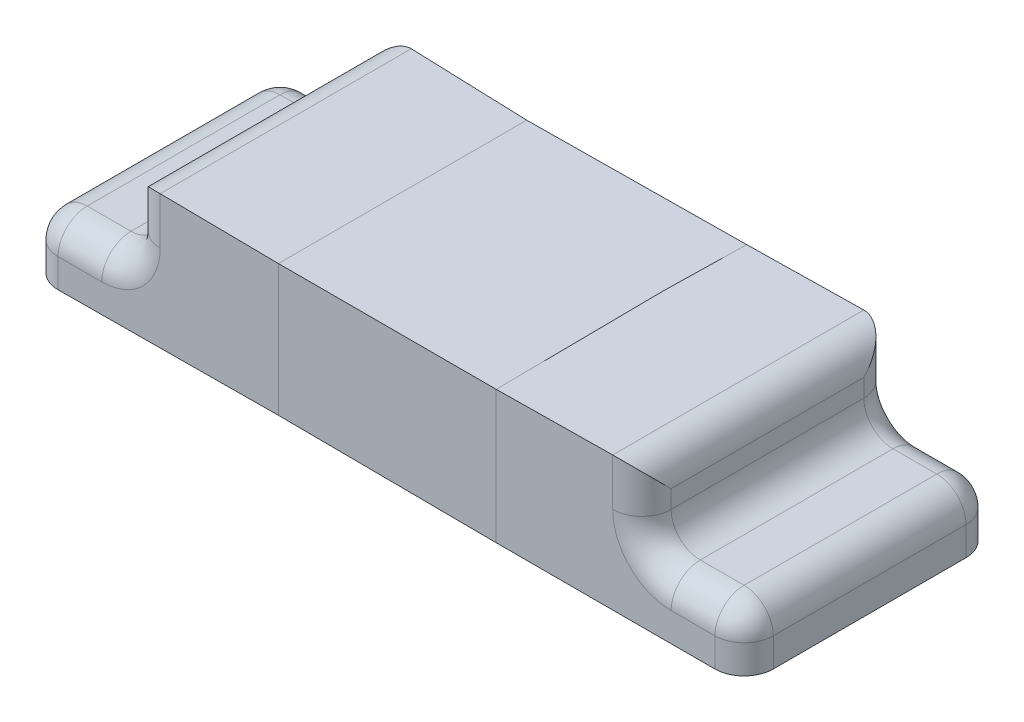
ISO-10303-21;
HEADER;
FILE_DESCRIPTION(('STEP AP214'),'2;1');
FILE_NAME('part.step','',(''),(''),'','','');
FILE_SCHEMA(('AUTOMOTIVE_DESIGN { 1 0 10303 214 1 1 1 1 }'));
ENDSEC;
DATA;
#1=APPLICATION_CONTEXT('core data for automotive mechanical design processes');
#2=APPLICATION_PROTOCOL_DEFINITION('international standard','automotive_design',2000,#1);
#3=PRODUCT_CONTEXT('',#1,'mechanical');
#4=PRODUCT('Part','Part','',(#3));
#5=PRODUCT_RELATED_PRODUCT_CATEGORY('part','',(#4));
#6=PRODUCT_DEFINITION_FORMATION('','',#4);
#7=PRODUCT_DEFINITION_CONTEXT('part definition',#1,'design');
#8=PRODUCT_DEFINITION('design','',#6,#7);
#9=PRODUCT_DEFINITION_SHAPE('','',#8);
#10=(LENGTH_UNIT() NAMED_UNIT(*) SI_UNIT(.MILLI.,.METRE.));
#11=(NAMED_UNIT(*) PLANE_ANGLE_UNIT() SI_UNIT($,.RADIAN.));
#12=(NAMED_UNIT(*) SI_UNIT($,.STERADIAN.) SOLID_ANGLE_UNIT());
#13=UNCERTAINTY_MEASURE_WITH_UNIT(LENGTH_MEASURE(1.E-05),#10,'distance_accuracy_value','');
#14=(GEOMETRIC_REPRESENTATION_CONTEXT(3) GLOBAL_UNCERTAINTY_ASSIGNED_CONTEXT((#13)) GLOBAL_UNIT_ASSIGNED_CONTEXT((#10,
#11,#12)) REPRESENTATION_CONTEXT('',''));
#15=CARTESIAN_POINT('',(0.,0.,0.));
#16=DIRECTION('',(0.,0.,1.));
#17=DIRECTION('',(1.,0.,0.));
#18=AXIS2_PLACEMENT_3D('',#15,#16,#17);
#19=CARTESIAN_POINT('',(-1.125,0.,0.33));
#20=DIRECTION('',(0.,1.,0.));
#21=DIRECTION('',(0.,0.,1.));
#22=AXIS2_PLACEMENT_3D('',#19,#20,#21);
#23=CYLINDRICAL_SURFACE('',#22,0.1);
#24=CARTESIAN_POINT('',(-1.125,0.098442990090282,0.33));
#25=DIRECTION('',(0.,-1.,0.));
#26=DIRECTION('',(0.,0.,-1.));
#27=AXIS2_PLACEMENT_3D('',#24,#25,#26);
#28=CIRCLE('',#27,0.1);
#29=CARTESIAN_POINT('',(-1.125,0.098442990090282,0.43));
#30=VERTEX_POINT('',#29);
#31=CARTESIAN_POINT('',(-1.225,0.098442990090282,0.33));
#32=VERTEX_POINT('',#31);
#33=EDGE_CURVE('E11',#30,#32,#28,.T.);
#34=ORIENTED_EDGE('',*,*,#33,.T.);
#35=DIRECTION('',(0.,1.,0.));
#36=VECTOR('',#35,1.);
#37=CARTESIAN_POINT('',(-1.225,0.098442990090282,0.33));
#38=LINE('',#37,#36);
#39=CARTESIAN_POINT('',(-1.225,0.,0.33));
#40=VERTEX_POINT('',#39);
#41=EDGE_CURVE('E216',#40,#32,#38,.T.);
#42=ORIENTED_EDGE('',*,*,#41,.F.);
#43=CARTESIAN_POINT('',(-1.125,0.,0.33));
#44=DIRECTION('',(0.,-1.,0.));
#45=DIRECTION('',(0.,0.,1.));
#46=AXIS2_PLACEMENT_3D('',#43,#44,#45);
#47=CIRCLE('',#46,0.1);
#48=CARTESIAN_POINT('',(-1.125,0.,0.43));
#49=VERTEX_POINT('',#48);
#50=EDGE_CURVE('E282',#49,#40,#47,.T.);
#51=ORIENTED_EDGE('',*,*,#50,.F.);
#52=DIRECTION('',(0.,-1.,0.));
#53=VECTOR('',#52,1.);
#54=CARTESIAN_POINT('',(-1.125,0.098442990090282,0.43));
#55=LINE('',#54,#53);
#56=EDGE_CURVE('E281',#30,#49,#55,.T.);
#57=ORIENTED_EDGE('',*,*,#56,.F.);
#58=EDGE_LOOP('',(#34,#42,#51,#57));
#59=FACE_BOUND('',#58,.T.);
#60=ADVANCED_FACE('F17',(#59),#23,.T.);
#61=CARTESIAN_POINT('',(-1.125,0.098442990090282,0.33));
#62=DIRECTION('',(0.,0.,1.));
#63=DIRECTION('',(1.,0.,0.));
#64=AXIS2_PLACEMENT_3D('',#61,#62,#63);
#65=SPHERICAL_SURFACE('',#64,0.1);
#66=CARTESIAN_POINT('',(-1.125,0.098442990090282,0.33));
#67=DIRECTION('',(1.,0.,0.));
#68=DIRECTION('',(0.,0.,-1.));
#69=AXIS2_PLACEMENT_3D('',#66,#67,#68);
#70=CIRCLE('',#69,0.1);
#71=CARTESIAN_POINT('',(-1.125,0.198442990090282,0.33));
#72=VERTEX_POINT('',#71);
#73=EDGE_CURVE('E265',#72,#30,#70,.T.);
#74=ORIENTED_EDGE('',*,*,#73,.F.);
#75=CARTESIAN_POINT('',(-1.125,0.098442990090282,0.33));
#76=DIRECTION('',(0.,0.,-1.));
#77=DIRECTION('',(-1.,0.,0.));
#78=AXIS2_PLACEMENT_3D('',#75,#76,#77);
#79=CIRCLE('',#78,0.1);
#80=EDGE_CURVE('E267',#32,#72,#79,.T.);
#81=ORIENTED_EDGE('',*,*,#80,.F.);
#82=ORIENTED_EDGE('',*,*,#33,.F.);
#83=EDGE_LOOP('',(#74,#81,#82));
#84=FACE_BOUND('',#83,.T.);
#85=ADVANCED_FACE('F264',(#84),#65,.T.);
#86=CARTESIAN_POINT('',(-1.125,0.,-0.33));
#87=DIRECTION('',(0.,-1.,0.));
#88=DIRECTION('',(0.,0.,-1.));
#89=AXIS2_PLACEMENT_3D('',#86,#87,#88);
#90=CYLINDRICAL_SURFACE('',#89,0.1);
#91=CARTESIAN_POINT('',(-1.125,0.,-0.33));
#92=DIRECTION('',(0.,-1.,0.));
#93=DIRECTION('',(0.,0.,1.));
#94=AXIS2_PLACEMENT_3D('',#91,#92,#93);
#95=CIRCLE('',#94,0.1);
#96=CARTESIAN_POINT('',(-1.225,0.,-0.33));
#97=VERTEX_POINT('',#96);
#98=CARTESIAN_POINT('',(-1.125,0.,-0.43));
#99=VERTEX_POINT('',#98);
#100=EDGE_CURVE('E457',#97,#99,#95,.T.);
#101=ORIENTED_EDGE('',*,*,#100,.F.);
#102=DIRECTION('',(0.,-1.,0.));
#103=VECTOR('',#102,1.);
#104=CARTESIAN_POINT('',(-1.225,0.,-0.33));
#105=LINE('',#104,#103);
#106=CARTESIAN_POINT('',(-1.225,0.098442990090282,-0.33));
#107=VERTEX_POINT('',#106);
#108=EDGE_CURVE('E205',#107,#97,#105,.T.);
#109=ORIENTED_EDGE('',*,*,#108,.F.);
#110=CARTESIAN_POINT('',(-1.125,0.098442990090282,-0.33));
#111=DIRECTION('',(0.,-1.,0.));
#112=DIRECTION('',(0.,0.,-1.));
#113=AXIS2_PLACEMENT_3D('',#110,#111,#112);
#114=CIRCLE('',#113,0.1);
#115=CARTESIAN_POINT('',(-1.125,0.098442990090282,-0.43));
#116=VERTEX_POINT('',#115);
#117=EDGE_CURVE('E30',#107,#116,#114,.T.);
#118=ORIENTED_EDGE('',*,*,#117,.T.);
#119=DIRECTION('',(0.,1.,0.));
#120=VECTOR('',#119,1.);
#121=CARTESIAN_POINT('',(-1.125,0.,-0.43));
#122=LINE('',#121,#120);
#123=EDGE_CURVE('E320',#99,#116,#122,.T.);
#124=ORIENTED_EDGE('',*,*,#123,.F.);
#125=EDGE_LOOP('',(#101,#109,#118,#124));
#126=FACE_BOUND('',#125,.T.);
#127=ADVANCED_FACE('F561',(#126),#90,.T.);
#128=CARTESIAN_POINT('',(-1.125,0.098442990090282,-0.33));
#129=DIRECTION('',(0.,0.,1.));
#130=DIRECTION('',(1.,0.,0.));
#131=AXIS2_PLACEMENT_3D('',#128,#129,#130);
#132=SPHERICAL_SURFACE('',#131,0.1);
#133=CARTESIAN_POINT('',(-1.125,0.098442990090282,-0.33));
#134=DIRECTION('',(0.,0.,1.));
#135=DIRECTION('',(-1.,0.,0.));
#136=AXIS2_PLACEMENT_3D('',#133,#134,#135);
#137=CIRCLE('',#136,0.1);
#138=CARTESIAN_POINT('',(-1.125,0.198442990090282,-0.33));
#139=VERTEX_POINT('',#138);
#140=EDGE_CURVE('E331',#139,#107,#137,.T.);
#141=ORIENTED_EDGE('',*,*,#140,.F.);
#142=CARTESIAN_POINT('',(-1.125,0.098442990090282,-0.33));
#143=DIRECTION('',(1.,0.,0.));
#144=DIRECTION('',(0.,0.,-1.));
#145=AXIS2_PLACEMENT_3D('',#142,#143,#144);
#146=CIRCLE('',#145,0.1);
#147=EDGE_CURVE('E305',#116,#139,#146,.T.);
#148=ORIENTED_EDGE('',*,*,#147,.F.);
#149=ORIENTED_EDGE('',*,*,#117,.F.);
#150=EDGE_LOOP('',(#141,#148,#149));
#151=FACE_BOUND('',#150,.T.);
#152=ADVANCED_FACE('F716',(#151),#132,.T.);
#153=CARTESIAN_POINT('',(-0.775,0.,-0.33));
#154=DIRECTION('',(0.,-1.,0.));
#155=DIRECTION('',(0.,0.,-1.));
#156=AXIS2_PLACEMENT_3D('',#153,#154,#155);
#157=CYLINDRICAL_SURFACE('',#156,0.1);
#158=CARTESIAN_POINT('',(-0.775,0.298442990090282,-0.33));
#159=DIRECTION('',(0.,1.,0.));
#160=DIRECTION('',(0.,0.,-1.));
#161=AXIS2_PLACEMENT_3D('',#158,#159,#160);
#162=CIRCLE('',#161,0.1);
#163=CARTESIAN_POINT('',(-0.775,0.298442990090282,-0.43));
#164=VERTEX_POINT('',#163);
#165=CARTESIAN_POINT('',(-0.875,0.298442990090282,-0.33));
#166=VERTEX_POINT('',#165);
#167=EDGE_CURVE('E637',#164,#166,#162,.T.);
#168=ORIENTED_EDGE('',*,*,#167,.T.);
#169=DIRECTION('',(0.,-1.,0.));
#170=VECTOR('',#169,1.);
#171=CARTESIAN_POINT('',(-0.875,0.298442990090282,-0.33));
#172=LINE('',#171,#170);
#173=CARTESIAN_POINT('',(-0.875,0.36,-0.33));
#174=VERTEX_POINT('',#173);
#175=EDGE_CURVE('E325',#174,#166,#172,.T.);
#176=ORIENTED_EDGE('',*,*,#175,.F.);
#177=CARTESIAN_POINT('',(-0.775,0.36,-0.33));
#178=DIRECTION('',(0.,-0.707106781186548,-0.707106781186548));
#179=DIRECTION('',(0.,0.707106781186548,-0.707106781186548));
#180=AXIS2_PLACEMENT_3D('',#177,#178,#179);
#181=ELLIPSE('',#180,0.141421356237309,0.1);
#182=CARTESIAN_POINT('',(-0.775,0.46,-0.43));
#183=VERTEX_POINT('',#182);
#184=EDGE_CURVE('E661',#174,#183,#181,.T.);
#185=ORIENTED_EDGE('',*,*,#184,.T.);
#186=DIRECTION('',(0.,1.,0.));
#187=VECTOR('',#186,1.);
#188=CARTESIAN_POINT('',(-0.775,0.298442990090282,-0.43));
#189=LINE('',#188,#187);
#190=EDGE_CURVE('E300',#164,#183,#189,.T.);
#191=ORIENTED_EDGE('',*,*,#190,.F.);
#192=EDGE_LOOP('',(#168,#176,#185,#191));
#193=FACE_BOUND('',#192,.T.);
#194=ADVANCED_FACE('F1270',(#193),#157,.T.);
#195=CARTESIAN_POINT('',(-0.775,0.36,0.43));
#196=DIRECTION('',(0.,0.,-1.));
#197=DIRECTION('',(-1.,0.,0.));
#198=AXIS2_PLACEMENT_3D('',#195,#196,#197);
#199=CYLINDRICAL_SURFACE('',#198,0.1);
#200=CARTESIAN_POINT('',(-0.775,0.36,0.33));
#201=DIRECTION('',(0.,0.707106781186548,-0.707106781186548));
#202=DIRECTION('',(0.,-0.707106781186548,-0.707106781186548));
#203=AXIS2_PLACEMENT_3D('',#200,#201,#202);
#204=ELLIPSE('',#203,0.141421356237309,0.1);
#205=CARTESIAN_POINT('',(-0.875,0.36,0.33));
#206=VERTEX_POINT('',#205);
#207=CARTESIAN_POINT('',(-0.775,0.46,0.43));
#208=VERTEX_POINT('',#207);
#209=EDGE_CURVE('E255',#206,#208,#204,.T.);
#210=ORIENTED_EDGE('',*,*,#209,.T.);
#211=DIRECTION('',(0.,0.,1.));
#212=VECTOR('',#211,1.);
#213=CARTESIAN_POINT('',(-0.775,0.46,-0.43));
#214=LINE('',#213,#212);
#215=EDGE_CURVE('E654',#183,#208,#214,.T.);
#216=ORIENTED_EDGE('',*,*,#215,.F.);
#217=ORIENTED_EDGE('',*,*,#184,.F.);
#218=DIRECTION('',(0.,0.,-1.));
#219=VECTOR('',#218,1.);
#220=CARTESIAN_POINT('',(-0.875,0.36,-0.33));
#221=LINE('',#220,#219);
#222=EDGE_CURVE('E653',#206,#174,#221,.T.);
#223=ORIENTED_EDGE('',*,*,#222,.F.);
#224=EDGE_LOOP('',(#210,#216,#217,#223));
#225=FACE_BOUND('',#224,.T.);
#226=ADVANCED_FACE('F512',(#225),#199,.T.);
#227=CARTESIAN_POINT('',(-0.975,0.298442990090282,-0.33));
#228=DIRECTION('',(0.,0.,-1.));
#229=DIRECTION('',(-1.,0.,0.));
#230=AXIS2_PLACEMENT_3D('',#227,#228,#229);
#231=TOROIDAL_SURFACE('',#230,0.2,0.1);
#232=CARTESIAN_POINT('',(-0.975,0.098442990090282,-0.33));
#233=DIRECTION('',(1.,0.,0.));
#234=DIRECTION('',(0.,0.,-1.));
#235=AXIS2_PLACEMENT_3D('',#232,#233,#234);
#236=CIRCLE('',#235,0.1);
#237=CARTESIAN_POINT('',(-0.975,0.098442990090282,-0.43));
#238=VERTEX_POINT('',#237);
#239=CARTESIAN_POINT('',(-0.975,0.198442990090282,-0.33));
#240=VERTEX_POINT('',#239);
#241=EDGE_CURVE('E308',#238,#240,#236,.T.);
#242=ORIENTED_EDGE('',*,*,#241,.T.);
#243=CARTESIAN_POINT('',(-0.975,0.298442990090282,-0.33));
#244=DIRECTION('',(0.,0.,1.));
#245=DIRECTION('',(-1.,0.,0.));
#246=AXIS2_PLACEMENT_3D('',#243,#244,#245);
#247=CIRCLE('',#246,0.1);
#248=EDGE_CURVE('E309',#240,#166,#247,.T.);
#249=ORIENTED_EDGE('',*,*,#248,.T.);
#250=ORIENTED_EDGE('',*,*,#167,.F.);
#251=CARTESIAN_POINT('',(-0.975,0.298442990090282,-0.43));
#252=DIRECTION('',(0.,0.,-1.));
#253=DIRECTION('',(-1.,0.,0.));
#254=AXIS2_PLACEMENT_3D('',#251,#252,#253);
#255=CIRCLE('',#254,0.2);
#256=EDGE_CURVE('E319',#164,#238,#255,.T.);
#257=ORIENTED_EDGE('',*,*,#256,.T.);
#258=EDGE_LOOP('',(#242,#249,#250,#257));
#259=FACE_BOUND('',#258,.T.);
#260=ADVANCED_FACE('F494',(#259),#231,.T.);
#261=CARTESIAN_POINT('',(-0.775,0.,0.33));
#262=DIRECTION('',(0.,1.,0.));
#263=DIRECTION('',(0.,0.,1.));
#264=AXIS2_PLACEMENT_3D('',#261,#262,#263);
#265=CYLINDRICAL_SURFACE('',#264,0.1);
#266=CARTESIAN_POINT('',(-0.775,0.298442990090282,0.33));
#267=DIRECTION('',(0.,1.,0.));
#268=DIRECTION('',(0.,0.,-1.));
#269=AXIS2_PLACEMENT_3D('',#266,#267,#268);
#270=CIRCLE('',#269,0.1);
#271=CARTESIAN_POINT('',(-0.875,0.298442990090282,0.33));
#272=VERTEX_POINT('',#271);
#273=CARTESIAN_POINT('',(-0.775,0.298442990090282,0.43));
#274=VERTEX_POINT('',#273);
#275=EDGE_CURVE('E353',#272,#274,#270,.T.);
#276=ORIENTED_EDGE('',*,*,#275,.T.);
#277=DIRECTION('',(0.,-1.,0.));
#278=VECTOR('',#277,1.);
#279=CARTESIAN_POINT('',(-0.775,0.46,0.43));
#280=LINE('',#279,#278);
#281=EDGE_CURVE('E379',#208,#274,#280,.T.);
#282=ORIENTED_EDGE('',*,*,#281,.F.);
#283=ORIENTED_EDGE('',*,*,#209,.F.);
#284=DIRECTION('',(0.,1.,0.));
#285=VECTOR('',#284,1.);
#286=CARTESIAN_POINT('',(-0.875,0.36,0.33));
#287=LINE('',#286,#285);
#288=EDGE_CURVE('E649',#272,#206,#287,.T.);
#289=ORIENTED_EDGE('',*,*,#288,.F.);
#290=EDGE_LOOP('',(#276,#282,#283,#289));
#291=FACE_BOUND('',#290,.T.);
#292=ADVANCED_FACE('F490',(#291),#265,.T.);
#293=CARTESIAN_POINT('',(-0.875,0.098442990090282,-0.33));
#294=DIRECTION('',(1.,0.,0.));
#295=DIRECTION('',(0.,0.,-1.));
#296=AXIS2_PLACEMENT_3D('',#293,#294,#295);
#297=CYLINDRICAL_SURFACE('',#296,0.1);
#298=DIRECTION('',(1.,0.,0.));
#299=VECTOR('',#298,1.);
#300=CARTESIAN_POINT('',(-1.125,0.098442990090282,-0.43));
#301=LINE('',#300,#299);
#302=EDGE_CURVE('E315',#116,#238,#301,.T.);
#303=ORIENTED_EDGE('',*,*,#302,.F.);
#304=ORIENTED_EDGE('',*,*,#147,.T.);
#305=DIRECTION('',(-1.,0.,0.));
#306=VECTOR('',#305,1.);
#307=CARTESIAN_POINT('',(-1.125,0.198442990090282,-0.33));
#308=LINE('',#307,#306);
#309=EDGE_CURVE('E337',#240,#139,#308,.T.);
#310=ORIENTED_EDGE('',*,*,#309,.F.);
#311=ORIENTED_EDGE('',*,*,#241,.F.);
#312=EDGE_LOOP('',(#303,#304,#310,#311));
#313=FACE_BOUND('',#312,.T.);
#314=ADVANCED_FACE('F493',(#313),#297,.T.);
#315=CARTESIAN_POINT('',(-0.975,0.298442990090282,0.));
#316=DIRECTION('',(0.,0.,1.));
#317=DIRECTION('',(1.,0.,0.));
#318=AXIS2_PLACEMENT_3D('',#315,#316,#317);
#319=CYLINDRICAL_SURFACE('',#318,0.1);
#320=CARTESIAN_POINT('',(-0.975,0.298442990090282,0.33));
#321=DIRECTION('',(0.,0.,1.));
#322=DIRECTION('',(1.,0.,0.));
#323=AXIS2_PLACEMENT_3D('',#320,#321,#322);
#324=CIRCLE('',#323,0.1);
#325=CARTESIAN_POINT('',(-0.975,0.198442990090282,0.33));
#326=VERTEX_POINT('',#325);
#327=EDGE_CURVE('E356',#326,#272,#324,.T.);
#328=ORIENTED_EDGE('',*,*,#327,.T.);
#329=DIRECTION('',(0.,0.,1.));
#330=VECTOR('',#329,1.);
#331=CARTESIAN_POINT('',(-0.875,0.298442990090282,-0.33));
#332=LINE('',#331,#330);
#333=EDGE_CURVE('E321',#166,#272,#332,.T.);
#334=ORIENTED_EDGE('',*,*,#333,.F.);
#335=ORIENTED_EDGE('',*,*,#248,.F.);
#336=DIRECTION('',(0.,0.,-1.));
#337=VECTOR('',#336,1.);
#338=CARTESIAN_POINT('',(-0.975,0.198442990090282,-0.33));
#339=LINE('',#338,#337);
#340=EDGE_CURVE('E664',#326,#240,#339,.T.);
#341=ORIENTED_EDGE('',*,*,#340,.F.);
#342=EDGE_LOOP('',(#328,#334,#335,#341));
#343=FACE_BOUND('',#342,.T.);
#344=ADVANCED_FACE('F1118',(#343),#319,.F.);
#345=CARTESIAN_POINT('',(-0.975,0.298442990090282,0.33));
#346=DIRECTION('',(0.,0.,1.));
#347=DIRECTION('',(1.,0.,0.));
#348=AXIS2_PLACEMENT_3D('',#345,#346,#347);
#349=TOROIDAL_SURFACE('',#348,0.2,0.1);
#350=ORIENTED_EDGE('',*,*,#275,.F.);
#351=ORIENTED_EDGE('',*,*,#327,.F.);
#352=CARTESIAN_POINT('',(-0.975,0.098442990090282,0.33));
#353=DIRECTION('',(1.,0.,0.));
#354=DIRECTION('',(0.,0.,-1.));
#355=AXIS2_PLACEMENT_3D('',#352,#353,#354);
#356=CIRCLE('',#355,0.1);
#357=CARTESIAN_POINT('',(-0.975,0.098442990090282,0.43));
#358=VERTEX_POINT('',#357);
#359=EDGE_CURVE('E279',#326,#358,#356,.T.);
#360=ORIENTED_EDGE('',*,*,#359,.T.);
#361=CARTESIAN_POINT('',(-0.975,0.298442990090282,0.43));
#362=DIRECTION('',(0.,0.,1.));
#363=DIRECTION('',(1.,0.,0.));
#364=AXIS2_PLACEMENT_3D('',#361,#362,#363);
#365=CIRCLE('',#364,0.2);
#366=EDGE_CURVE('E292',#358,#274,#365,.T.);
#367=ORIENTED_EDGE('',*,*,#366,.T.);
#368=EDGE_LOOP('',(#350,#351,#360,#367));
#369=FACE_BOUND('',#368,.T.);
#370=ADVANCED_FACE('F1113',(#369),#349,.T.);
#371=CARTESIAN_POINT('',(-1.125,0.098442990090282,0.43));
#372=DIRECTION('',(0.,0.,-1.));
#373=DIRECTION('',(-1.,0.,0.));
#374=AXIS2_PLACEMENT_3D('',#371,#372,#373);
#375=CYLINDRICAL_SURFACE('',#374,0.1);
#376=DIRECTION('',(0.,0.,1.));
#377=VECTOR('',#376,1.);
#378=CARTESIAN_POINT('',(-1.125,0.198442990090282,-0.33));
#379=LINE('',#378,#377);
#380=EDGE_CURVE('E334',#139,#72,#379,.T.);
#381=ORIENTED_EDGE('',*,*,#380,.F.);
#382=ORIENTED_EDGE('',*,*,#140,.T.);
#383=DIRECTION('',(0.,0.,-1.));
#384=VECTOR('',#383,1.);
#385=CARTESIAN_POINT('',(-1.225,0.098442990090282,-0.33));
#386=LINE('',#385,#384);
#387=EDGE_CURVE('E336',#32,#107,#386,.T.);
#388=ORIENTED_EDGE('',*,*,#387,.F.);
#389=ORIENTED_EDGE('',*,*,#80,.T.);
#390=EDGE_LOOP('',(#381,#382,#388,#389));
#391=FACE_BOUND('',#390,.T.);
#392=ADVANCED_FACE('F719',(#391),#375,.T.);
#393=CARTESIAN_POINT('',(-1.225,0.098442990090282,0.33));
#394=DIRECTION('',(1.,0.,0.));
#395=DIRECTION('',(0.,0.,-1.));
#396=AXIS2_PLACEMENT_3D('',#393,#394,#395);
#397=CYLINDRICAL_SURFACE('',#396,0.1);
#398=DIRECTION('',(1.,0.,0.));
#399=VECTOR('',#398,1.);
#400=CARTESIAN_POINT('',(-1.125,0.198442990090282,0.33));
#401=LINE('',#400,#399);
#402=EDGE_CURVE('E277',#72,#326,#401,.T.);
#403=ORIENTED_EDGE('',*,*,#402,.F.);
#404=ORIENTED_EDGE('',*,*,#73,.T.);
#405=DIRECTION('',(-1.,0.,0.));
#406=VECTOR('',#405,1.);
#407=CARTESIAN_POINT('',(-1.125,0.098442990090282,0.43));
#408=LINE('',#407,#406);
#409=EDGE_CURVE('E275',#358,#30,#408,.T.);
#410=ORIENTED_EDGE('',*,*,#409,.F.);
#411=ORIENTED_EDGE('',*,*,#359,.F.);
#412=EDGE_LOOP('',(#403,#404,#410,#411));
#413=FACE_BOUND('',#412,.T.);
#414=ADVANCED_FACE('F272',(#413),#397,.T.);
#415=CARTESIAN_POINT('',(-1.225,0.,0.));
#416=DIRECTION('',(1.,0.,0.));
#417=DIRECTION('',(0.,1.,0.));
#418=AXIS2_PLACEMENT_3D('',#415,#416,#417);
#419=PLANE('',#418);
#420=ORIENTED_EDGE('',*,*,#387,.T.);
#421=ORIENTED_EDGE('',*,*,#108,.T.);
#422=DIRECTION('',(0.,0.,-1.));
#423=VECTOR('',#422,1.);
#424=CARTESIAN_POINT('',(-1.225,0.,0.33));
#425=LINE('',#424,#423);
#426=EDGE_CURVE('E681',#40,#97,#425,.T.);
#427=ORIENTED_EDGE('',*,*,#426,.F.);
#428=ORIENTED_EDGE('',*,*,#41,.T.);
#429=EDGE_LOOP('',(#420,#421,#427,#428));
#430=FACE_BOUND('',#429,.T.);
#431=ADVANCED_FACE('F720',(#430),#419,.F.);
#432=CARTESIAN_POINT('',(-1.225,0.198442990090282,0.43));
#433=DIRECTION('',(0.,1.,0.));
#434=DIRECTION('',(1.,0.,0.));
#435=AXIS2_PLACEMENT_3D('',#432,#433,#434);
#436=PLANE('',#435);
#437=ORIENTED_EDGE('',*,*,#402,.T.);
#438=ORIENTED_EDGE('',*,*,#340,.T.);
#439=ORIENTED_EDGE('',*,*,#309,.T.);
#440=ORIENTED_EDGE('',*,*,#380,.T.);
#441=EDGE_LOOP('',(#437,#438,#439,#440));
#442=FACE_BOUND('',#441,.T.);
#443=ADVANCED_FACE('F19',(#442),#436,.T.);
#444=CARTESIAN_POINT('',(-0.875,0.,0.));
#445=DIRECTION('',(1.,0.,0.));
#446=DIRECTION('',(0.,1.,0.));
#447=AXIS2_PLACEMENT_3D('',#444,#445,#446);
#448=PLANE('',#447);
#449=ORIENTED_EDGE('',*,*,#288,.T.);
#450=ORIENTED_EDGE('',*,*,#222,.T.);
#451=ORIENTED_EDGE('',*,*,#175,.T.);
#452=ORIENTED_EDGE('',*,*,#333,.T.);
#453=EDGE_LOOP('',(#449,#450,#451,#452));
#454=FACE_BOUND('',#453,.T.);
#455=ADVANCED_FACE('F556',(#454),#448,.F.);
#456=CARTESIAN_POINT('',(-0.875,0.46,0.43));
#457=DIRECTION('',(0.,1.,0.));
#458=DIRECTION('',(1.,0.,0.));
#459=AXIS2_PLACEMENT_3D('',#456,#457,#458);
#460=PLANE('',#459);
#461=DIRECTION('',(1.,0.,0.));
#462=VECTOR('',#461,1.);
#463=CARTESIAN_POINT('',(-0.775,0.46,-0.43));
#464=LINE('',#463,#462);
#465=CARTESIAN_POINT('',(-0.375,0.450527864045,-0.4252639320225));
#466=VERTEX_POINT('',#465);
#467=EDGE_CURVE('E294',#183,#466,#464,.T.);
#468=ORIENTED_EDGE('',*,*,#467,.F.);
#469=ORIENTED_EDGE('',*,*,#215,.T.);
#470=DIRECTION('',(1.,0.,0.));
#471=VECTOR('',#470,1.);
#472=CARTESIAN_POINT('',(-0.775,0.46,0.43));
#473=LINE('',#472,#471);
#474=CARTESIAN_POINT('',(-0.375,0.450527864045,0.4252639320225));
#475=VERTEX_POINT('',#474);
#476=EDGE_CURVE('E286',#208,#475,#473,.T.);
#477=ORIENTED_EDGE('',*,*,#476,.T.);
#478=CARTESIAN_POINT('',(-0.375,0.45,-0.4252639320225));
#479=DIRECTION('',(0.,0.,1.));
#480=VECTOR('',#479,1.);
#481=LINE('',#478,#480);
#482=EDGE_CURVE('E387',#466,#475,#481,.T.);
#483=ORIENTED_EDGE('',*,*,#482,.F.);
#484=EDGE_LOOP('',(#468,#469,#477,#483));
#485=FACE_BOUND('',#484,.T.);
#486=ADVANCED_FACE('F511',(#485),#460,.T.);
#487=CARTESIAN_POINT('',(-0.875,0.,0.43));
#488=DIRECTION('',(0.,0.,1.));
#489=DIRECTION('',(1.,0.,0.));
#490=AXIS2_PLACEMENT_3D('',#487,#488,#489);
#491=PLANE('',#490);
#492=ORIENTED_EDGE('',*,*,#409,.T.);
#493=ORIENTED_EDGE('',*,*,#56,.T.);
#494=DIRECTION('',(1.,0.,0.));
#495=VECTOR('',#494,1.);
#496=CARTESIAN_POINT('',(-1.125,0.,0.43));
#497=LINE('',#496,#495);
#498=CARTESIAN_POINT('',(-0.375,0.,0.425));
#499=VERTEX_POINT('',#498);
#500=EDGE_CURVE('E424',#49,#499,#497,.T.);
#501=ORIENTED_EDGE('',*,*,#500,.T.);
#502=CARTESIAN_POINT('',(-0.375,0.450527864045,0.425));
#503=DIRECTION('',(0.,-1.,0.));
#504=VECTOR('',#503,1.);
#505=LINE('',#502,#504);
#506=EDGE_CURVE('E414',#475,#499,#505,.T.);
#507=ORIENTED_EDGE('',*,*,#506,.F.);
#508=ORIENTED_EDGE('',*,*,#476,.F.);
#509=ORIENTED_EDGE('',*,*,#281,.T.);
#510=ORIENTED_EDGE('',*,*,#366,.F.);
#511=EDGE_LOOP('',(#492,#493,#501,#507,#508,#509,#510));
#512=FACE_BOUND('',#511,.T.);
#513=ADVANCED_FACE('F289',(#512),#491,.T.);
#514=CARTESIAN_POINT('',(-0.875,0.,-0.43));
#515=DIRECTION('',(0.,0.,-1.));
#516=DIRECTION('',(0.,-1.,0.));
#517=AXIS2_PLACEMENT_3D('',#514,#515,#516);
#518=PLANE('',#517);
#519=DIRECTION('',(1.,0.,0.));
#520=VECTOR('',#519,1.);
#521=CARTESIAN_POINT('',(-1.125,0.,-0.43));
#522=LINE('',#521,#520);
#523=CARTESIAN_POINT('',(-0.375,0.,-0.425));
#524=VERTEX_POINT('',#523);
#525=EDGE_CURVE('E446',#99,#524,#522,.T.);
#526=ORIENTED_EDGE('',*,*,#525,.F.);
#527=ORIENTED_EDGE('',*,*,#123,.T.);
#528=ORIENTED_EDGE('',*,*,#302,.T.);
#529=ORIENTED_EDGE('',*,*,#256,.F.);
#530=ORIENTED_EDGE('',*,*,#190,.T.);
#531=ORIENTED_EDGE('',*,*,#467,.T.);
#532=CARTESIAN_POINT('',(-0.375,0.,-0.425));
#533=DIRECTION('',(0.,1.,0.));
#534=VECTOR('',#533,1.);
#535=LINE('',#532,#534);
#536=EDGE_CURVE('E397',#524,#466,#535,.T.);
#537=ORIENTED_EDGE('',*,*,#536,.F.);
#538=EDGE_LOOP('',(#526,#527,#528,#529,#530,#531,#537));
#539=FACE_BOUND('',#538,.T.);
#540=ADVANCED_FACE('F510',(#539),#518,.T.);
#541=CARTESIAN_POINT('',(1.125,0.,0.33));
#542=DIRECTION('',(0.,-1.,0.));
#543=DIRECTION('',(0.,0.,-1.));
#544=AXIS2_PLACEMENT_3D('',#541,#542,#543);
#545=CYLINDRICAL_SURFACE('',#544,0.1);
#546=CARTESIAN_POINT('',(1.125,0.098442990090282,0.33));
#547=DIRECTION('',(0.,-1.,0.));
#548=DIRECTION('',(0.,0.,-1.));
#549=AXIS2_PLACEMENT_3D('',#546,#547,#548);
#550=CIRCLE('',#549,0.1);
#551=CARTESIAN_POINT('',(1.225,0.098442990090282,0.33));
#552=VERTEX_POINT('',#551);
#553=CARTESIAN_POINT('',(1.125,0.098442990090282,0.43));
#554=VERTEX_POINT('',#553);
#555=EDGE_CURVE('E677',#552,#554,#550,.T.);
#556=ORIENTED_EDGE('',*,*,#555,.T.);
#557=DIRECTION('',(0.,1.,0.));
#558=VECTOR('',#557,1.);
#559=CARTESIAN_POINT('',(1.125,0.098442990090282,0.43));
#560=LINE('',#559,#558);
#561=CARTESIAN_POINT('',(1.125,0.,0.43));
#562=VERTEX_POINT('',#561);
#563=EDGE_CURVE('E402',#562,#554,#560,.T.);
#564=ORIENTED_EDGE('',*,*,#563,.F.);
#565=CARTESIAN_POINT('',(1.125,0.,0.33));
#566=DIRECTION('',(0.,-1.,0.));
#567=DIRECTION('',(0.,0.,1.));
#568=AXIS2_PLACEMENT_3D('',#565,#566,#567);
#569=CIRCLE('',#568,0.1);
#570=CARTESIAN_POINT('',(1.225,0.,0.33));
#571=VERTEX_POINT('',#570);
#572=EDGE_CURVE('E439',#571,#562,#569,.T.);
#573=ORIENTED_EDGE('',*,*,#572,.F.);
#574=DIRECTION('',(0.,-1.,0.));
#575=VECTOR('',#574,1.);
#576=CARTESIAN_POINT('',(1.225,0.098442990090282,0.33));
#577=LINE('',#576,#575);
#578=EDGE_CURVE('E632',#552,#571,#577,.T.);
#579=ORIENTED_EDGE('',*,*,#578,.F.);
#580=EDGE_LOOP('',(#556,#564,#573,#579));
#581=FACE_BOUND('',#580,.T.);
#582=ADVANCED_FACE('F565',(#581),#545,.T.);
#583=CARTESIAN_POINT('',(1.125,0.098442990090282,0.33));
#584=DIRECTION('',(0.,0.,1.));
#585=DIRECTION('',(1.,0.,0.));
#586=AXIS2_PLACEMENT_3D('',#583,#584,#585);
#587=SPHERICAL_SURFACE('',#586,0.1);
#588=CARTESIAN_POINT('',(1.125,0.098442990090282,0.33));
#589=DIRECTION('',(0.,0.,-1.));
#590=DIRECTION('',(1.,0.,0.));
#591=AXIS2_PLACEMENT_3D('',#588,#589,#590);
#592=CIRCLE('',#591,0.1);
#593=CARTESIAN_POINT('',(1.125,0.198442990090282,0.33));
#594=VERTEX_POINT('',#593);
#595=EDGE_CURVE('E347',#594,#552,#592,.T.);
#596=ORIENTED_EDGE('',*,*,#595,.F.);
#597=CARTESIAN_POINT('',(1.125,0.098442990090282,0.33));
#598=DIRECTION('',(-1.,0.,0.));
#599=DIRECTION('',(0.,0.,1.));
#600=AXIS2_PLACEMENT_3D('',#597,#598,#599);
#601=CIRCLE('',#600,0.1);
#602=EDGE_CURVE('E631',#554,#594,#601,.T.);
#603=ORIENTED_EDGE('',*,*,#602,.F.);
#604=ORIENTED_EDGE('',*,*,#555,.F.);
#605=EDGE_LOOP('',(#596,#603,#604));
#606=FACE_BOUND('',#605,.T.);
#607=ADVANCED_FACE('F562',(#606),#587,.T.);
#608=CARTESIAN_POINT('',(1.125,0.,-0.33));
#609=DIRECTION('',(0.,1.,0.));
#610=DIRECTION('',(0.,0.,1.));
#611=AXIS2_PLACEMENT_3D('',#608,#609,#610);
#612=CYLINDRICAL_SURFACE('',#611,0.1);
#613=CARTESIAN_POINT('',(1.125,0.,-0.33));
#614=DIRECTION('',(0.,-1.,0.));
#615=DIRECTION('',(0.,0.,1.));
#616=AXIS2_PLACEMENT_3D('',#613,#614,#615);
#617=CIRCLE('',#616,0.1);
#618=CARTESIAN_POINT('',(1.125,0.,-0.43));
#619=VERTEX_POINT('',#618);
#620=CARTESIAN_POINT('',(1.225,0.,-0.33));
#621=VERTEX_POINT('',#620);
#622=EDGE_CURVE('E445',#619,#621,#617,.T.);
#623=ORIENTED_EDGE('',*,*,#622,.F.);
#624=DIRECTION('',(0.,-1.,0.));
#625=VECTOR('',#624,1.);
#626=CARTESIAN_POINT('',(1.125,0.,-0.43));
#627=LINE('',#626,#625);
#628=CARTESIAN_POINT('',(1.125,0.098442990090282,-0.43));
#629=VERTEX_POINT('',#628);
#630=EDGE_CURVE('E314',#629,#619,#627,.T.);
#631=ORIENTED_EDGE('',*,*,#630,.F.);
#632=CARTESIAN_POINT('',(1.125,0.098442990090282,-0.33));
#633=DIRECTION('',(0.,-1.,0.));
#634=DIRECTION('',(0.,0.,-1.));
#635=AXIS2_PLACEMENT_3D('',#632,#633,#634);
#636=CIRCLE('',#635,0.1);
#637=CARTESIAN_POINT('',(1.225,0.098442990090282,-0.33));
#638=VERTEX_POINT('',#637);
#639=EDGE_CURVE('E674',#629,#638,#636,.T.);
#640=ORIENTED_EDGE('',*,*,#639,.T.);
#641=DIRECTION('',(0.,1.,0.));
#642=VECTOR('',#641,1.);
#643=CARTESIAN_POINT('',(1.225,0.,-0.33));
#644=LINE('',#643,#642);
#645=EDGE_CURVE('E622',#621,#638,#644,.T.);
#646=ORIENTED_EDGE('',*,*,#645,.F.);
#647=EDGE_LOOP('',(#623,#631,#640,#646));
#648=FACE_BOUND('',#647,.T.);
#649=ADVANCED_FACE('F564',(#648),#612,.T.);
#650=CARTESIAN_POINT('',(1.125,0.098442990090282,-0.33));
#651=DIRECTION('',(0.,0.,1.));
#652=DIRECTION('',(1.,0.,0.));
#653=AXIS2_PLACEMENT_3D('',#650,#651,#652);
#654=SPHERICAL_SURFACE('',#653,0.1);
#655=CARTESIAN_POINT('',(1.125,0.098442990090282,-0.33));
#656=DIRECTION('',(-1.,0.,0.));
#657=DIRECTION('',(0.,0.,1.));
#658=AXIS2_PLACEMENT_3D('',#655,#656,#657);
#659=CIRCLE('',#658,0.1);
#660=CARTESIAN_POINT('',(1.125,0.198442990090282,-0.33));
#661=VERTEX_POINT('',#660);
#662=EDGE_CURVE('E329',#661,#629,#659,.T.);
#663=ORIENTED_EDGE('',*,*,#662,.F.);
#664=CARTESIAN_POINT('',(1.125,0.098442990090282,-0.33));
#665=DIRECTION('',(0.,0.,1.));
#666=DIRECTION('',(1.,0.,0.));
#667=AXIS2_PLACEMENT_3D('',#664,#665,#666);
#668=CIRCLE('',#667,0.1);
#669=EDGE_CURVE('E363',#638,#661,#668,.T.);
#670=ORIENTED_EDGE('',*,*,#669,.F.);
#671=ORIENTED_EDGE('',*,*,#639,.F.);
#672=EDGE_LOOP('',(#663,#670,#671));
#673=FACE_BOUND('',#672,.T.);
#674=ADVANCED_FACE('F1322',(#673),#654,.T.);
#675=CARTESIAN_POINT('',(0.775,0.,-0.33));
#676=DIRECTION('',(0.,1.,0.));
#677=DIRECTION('',(0.,0.,1.));
#678=AXIS2_PLACEMENT_3D('',#675,#676,#677);
#679=CYLINDRICAL_SURFACE('',#678,0.1);
#680=CARTESIAN_POINT('',(0.775,0.298442990090282,-0.33));
#681=DIRECTION('',(0.,1.,0.));
#682=DIRECTION('',(0.,0.,-1.));
#683=AXIS2_PLACEMENT_3D('',#680,#681,#682);
#684=CIRCLE('',#683,0.1);
#685=CARTESIAN_POINT('',(0.875,0.298442990090282,-0.33));
#686=VERTEX_POINT('',#685);
#687=CARTESIAN_POINT('',(0.775,0.298442990090282,-0.43));
#688=VERTEX_POINT('',#687);
#689=EDGE_CURVE('E348',#686,#688,#684,.T.);
#690=ORIENTED_EDGE('',*,*,#689,.T.);
#691=DIRECTION('',(0.,-1.,0.));
#692=VECTOR('',#691,1.);
#693=CARTESIAN_POINT('',(0.775,0.298442990090282,-0.43));
#694=LINE('',#693,#692);
#695=CARTESIAN_POINT('',(0.775,0.46,-0.43));
#696=VERTEX_POINT('',#695);
#697=EDGE_CURVE('E421',#696,#688,#694,.T.);
#698=ORIENTED_EDGE('',*,*,#697,.F.);
#699=CARTESIAN_POINT('',(0.775,0.36,-0.33));
#700=DIRECTION('',(0.,-0.707106781186548,-0.707106781186548));
#701=DIRECTION('',(0.,-0.707106781186548,0.707106781186548));
#702=AXIS2_PLACEMENT_3D('',#699,#700,#701);
#703=ELLIPSE('',#702,0.141421356237309,0.1);
#704=CARTESIAN_POINT('',(0.875,0.36,-0.33));
#705=VERTEX_POINT('',#704);
#706=EDGE_CURVE('E351',#696,#705,#703,.T.);
#707=ORIENTED_EDGE('',*,*,#706,.T.);
#708=DIRECTION('',(0.,1.,0.));
#709=VECTOR('',#708,1.);
#710=CARTESIAN_POINT('',(0.875,0.298442990090282,-0.33));
#711=LINE('',#710,#709);
#712=EDGE_CURVE('E612',#686,#705,#711,.T.);
#713=ORIENTED_EDGE('',*,*,#712,.F.);
#714=EDGE_LOOP('',(#690,#698,#707,#713));
#715=FACE_BOUND('',#714,.T.);
#716=ADVANCED_FACE('F1306',(#715),#679,.T.);
#717=CARTESIAN_POINT('',(0.775,0.36,0.));
#718=DIRECTION('',(0.,0.,1.));
#719=DIRECTION('',(1.,0.,0.));
#720=AXIS2_PLACEMENT_3D('',#717,#718,#719);
#721=CYLINDRICAL_SURFACE('',#720,0.1);
#722=CARTESIAN_POINT('',(0.775,0.36,0.33));
#723=DIRECTION('',(0.,0.707106781186548,-0.707106781186548));
#724=DIRECTION('',(0.,0.707106781186548,0.707106781186548));
#725=AXIS2_PLACEMENT_3D('',#722,#723,#724);
#726=ELLIPSE('',#725,0.141421356237309,0.1);
#727=CARTESIAN_POINT('',(0.775,0.46,0.43));
#728=VERTEX_POINT('',#727);
#729=CARTESIAN_POINT('',(0.875,0.36,0.33));
#730=VERTEX_POINT('',#729);
#731=EDGE_CURVE('E352',#728,#730,#726,.T.);
#732=ORIENTED_EDGE('',*,*,#731,.T.);
#733=DIRECTION('',(0.,0.,1.));
#734=VECTOR('',#733,1.);
#735=CARTESIAN_POINT('',(0.875,0.36,-0.33));
#736=LINE('',#735,#734);
#737=EDGE_CURVE('E344',#705,#730,#736,.T.);
#738=ORIENTED_EDGE('',*,*,#737,.F.);
#739=ORIENTED_EDGE('',*,*,#706,.F.);
#740=DIRECTION('',(0.,0.,-1.));
#741=VECTOR('',#740,1.);
#742=CARTESIAN_POINT('',(0.775,0.46,-0.43));
#743=LINE('',#742,#741);
#744=EDGE_CURVE('E368',#728,#696,#743,.T.);
#745=ORIENTED_EDGE('',*,*,#744,.F.);
#746=EDGE_LOOP('',(#732,#738,#739,#745));
#747=FACE_BOUND('',#746,.T.);
#748=ADVANCED_FACE('F1301',(#747),#721,.T.);
#749=CARTESIAN_POINT('',(0.975,0.298442990090282,-0.33));
#750=DIRECTION('',(0.,0.,1.));
#751=DIRECTION('',(1.,0.,0.));
#752=AXIS2_PLACEMENT_3D('',#749,#750,#751);
#753=TOROIDAL_SURFACE('',#752,0.2,0.1);
#754=CARTESIAN_POINT('',(0.975,0.098442990090282,-0.33));
#755=DIRECTION('',(-1.,0.,0.));
#756=DIRECTION('',(0.,0.,1.));
#757=AXIS2_PLACEMENT_3D('',#754,#755,#756);
#758=CIRCLE('',#757,0.1);
#759=CARTESIAN_POINT('',(0.975,0.198442990090282,-0.33));
#760=VERTEX_POINT('',#759);
#761=CARTESIAN_POINT('',(0.975,0.098442990090282,-0.43));
#762=VERTEX_POINT('',#761);
#763=EDGE_CURVE('E685',#760,#762,#758,.T.);
#764=ORIENTED_EDGE('',*,*,#763,.T.);
#765=CARTESIAN_POINT('',(0.975,0.298442990090282,-0.43));
#766=DIRECTION('',(0.,0.,-1.));
#767=DIRECTION('',(1.,0.,0.));
#768=AXIS2_PLACEMENT_3D('',#765,#766,#767);
#769=CIRCLE('',#768,0.2);
#770=EDGE_CURVE('E408',#762,#688,#769,.T.);
#771=ORIENTED_EDGE('',*,*,#770,.T.);
#772=ORIENTED_EDGE('',*,*,#689,.F.);
#773=CARTESIAN_POINT('',(0.975,0.298442990090282,-0.33));
#774=DIRECTION('',(0.,0.,1.));
#775=DIRECTION('',(1.,0.,0.));
#776=AXIS2_PLACEMENT_3D('',#773,#774,#775);
#777=CIRCLE('',#776,0.1);
#778=EDGE_CURVE('E670',#686,#760,#777,.T.);
#779=ORIENTED_EDGE('',*,*,#778,.T.);
#780=EDGE_LOOP('',(#764,#771,#772,#779));
#781=FACE_BOUND('',#780,.T.);
#782=ADVANCED_FACE('F505',(#781),#753,.T.);
#783=CARTESIAN_POINT('',(0.775,0.,0.33));
#784=DIRECTION('',(0.,-1.,0.));
#785=DIRECTION('',(0.,0.,-1.));
#786=AXIS2_PLACEMENT_3D('',#783,#784,#785);
#787=CYLINDRICAL_SURFACE('',#786,0.1);
#788=CARTESIAN_POINT('',(0.775,0.298442990090282,0.33));
#789=DIRECTION('',(0.,1.,0.));
#790=DIRECTION('',(0.,0.,-1.));
#791=AXIS2_PLACEMENT_3D('',#788,#789,#790);
#792=CIRCLE('',#791,0.1);
#793=CARTESIAN_POINT('',(0.775,0.298442990090282,0.43));
#794=VERTEX_POINT('',#793);
#795=CARTESIAN_POINT('',(0.875,0.298442990090282,0.33));
#796=VERTEX_POINT('',#795);
#797=EDGE_CURVE('E326',#794,#796,#792,.T.);
#798=ORIENTED_EDGE('',*,*,#797,.T.);
#799=DIRECTION('',(0.,-1.,0.));
#800=VECTOR('',#799,1.);
#801=CARTESIAN_POINT('',(0.875,0.36,0.33));
#802=LINE('',#801,#800);
#803=EDGE_CURVE('E339',#730,#796,#802,.T.);
#804=ORIENTED_EDGE('',*,*,#803,.F.);
#805=ORIENTED_EDGE('',*,*,#731,.F.);
#806=DIRECTION('',(0.,1.,0.));
#807=VECTOR('',#806,1.);
#808=CARTESIAN_POINT('',(0.775,0.46,0.43));
#809=LINE('',#808,#807);
#810=EDGE_CURVE('E357',#794,#728,#809,.T.);
#811=ORIENTED_EDGE('',*,*,#810,.F.);
#812=EDGE_LOOP('',(#798,#804,#805,#811));
#813=FACE_BOUND('',#812,.T.);
#814=ADVANCED_FACE('F502',(#813),#787,.T.);
#815=CARTESIAN_POINT('',(0.975,0.298442990090282,0.43));
#816=DIRECTION('',(0.,0.,-1.));
#817=DIRECTION('',(-1.,0.,0.));
#818=AXIS2_PLACEMENT_3D('',#815,#816,#817);
#819=CYLINDRICAL_SURFACE('',#818,0.1);
#820=CARTESIAN_POINT('',(0.975,0.298442990090282,0.33));
#821=DIRECTION('',(0.,0.,1.));
#822=DIRECTION('',(-1.,0.,0.));
#823=AXIS2_PLACEMENT_3D('',#820,#821,#822);
#824=CIRCLE('',#823,0.1);
#825=CARTESIAN_POINT('',(0.975,0.198442990090282,0.33));
#826=VERTEX_POINT('',#825);
#827=EDGE_CURVE('E330',#796,#826,#824,.T.);
#828=ORIENTED_EDGE('',*,*,#827,.T.);
#829=DIRECTION('',(0.,0.,1.));
#830=VECTOR('',#829,1.);
#831=CARTESIAN_POINT('',(0.975,0.198442990090282,-0.33));
#832=LINE('',#831,#830);
#833=EDGE_CURVE('E642',#760,#826,#832,.T.);
#834=ORIENTED_EDGE('',*,*,#833,.F.);
#835=ORIENTED_EDGE('',*,*,#778,.F.);
#836=DIRECTION('',(0.,0.,-1.));
#837=VECTOR('',#836,1.);
#838=CARTESIAN_POINT('',(0.875,0.298442990090282,-0.33));
#839=LINE('',#838,#837);
#840=EDGE_CURVE('E343',#796,#686,#839,.T.);
#841=ORIENTED_EDGE('',*,*,#840,.F.);
#842=EDGE_LOOP('',(#828,#834,#835,#841));
#843=FACE_BOUND('',#842,.T.);
#844=ADVANCED_FACE('F500',(#843),#819,.F.);
#845=CARTESIAN_POINT('',(1.225,0.098442990090282,-0.33));
#846=DIRECTION('',(-1.,0.,0.));
#847=DIRECTION('',(0.,0.,1.));
#848=AXIS2_PLACEMENT_3D('',#845,#846,#847);
#849=CYLINDRICAL_SURFACE('',#848,0.1);
#850=DIRECTION('',(-1.,0.,0.));
#851=VECTOR('',#850,1.);
#852=CARTESIAN_POINT('',(1.125,0.198442990090282,-0.33));
#853=LINE('',#852,#851);
#854=EDGE_CURVE('E361',#661,#760,#853,.T.);
#855=ORIENTED_EDGE('',*,*,#854,.F.);
#856=ORIENTED_EDGE('',*,*,#662,.T.);
#857=DIRECTION('',(1.,0.,0.));
#858=VECTOR('',#857,1.);
#859=CARTESIAN_POINT('',(1.125,0.098442990090282,-0.43));
#860=LINE('',#859,#858);
#861=EDGE_CURVE('E310',#762,#629,#860,.T.);
#862=ORIENTED_EDGE('',*,*,#861,.F.);
#863=ORIENTED_EDGE('',*,*,#763,.F.);
#864=EDGE_LOOP('',(#855,#856,#862,#863));
#865=FACE_BOUND('',#864,.T.);
#866=ADVANCED_FACE('F496',(#865),#849,.T.);
#867=CARTESIAN_POINT('',(0.975,0.298442990090282,0.33));
#868=DIRECTION('',(0.,0.,-1.));
#869=DIRECTION('',(-1.,0.,0.));
#870=AXIS2_PLACEMENT_3D('',#867,#868,#869);
#871=TOROIDAL_SURFACE('',#870,0.2,0.1);
#872=CARTESIAN_POINT('',(0.975,0.298442990090282,0.43));
#873=DIRECTION('',(0.,0.,1.));
#874=DIRECTION('',(-1.,0.,0.));
#875=AXIS2_PLACEMENT_3D('',#872,#873,#874);
#876=CIRCLE('',#875,0.2);
#877=CARTESIAN_POINT('',(0.975,0.098442990090282,0.43));
#878=VERTEX_POINT('',#877);
#879=EDGE_CURVE('E362',#794,#878,#876,.T.);
#880=ORIENTED_EDGE('',*,*,#879,.T.);
#881=CARTESIAN_POINT('',(0.975,0.098442990090282,0.33));
#882=DIRECTION('',(-1.,0.,0.));
#883=DIRECTION('',(0.,0.,1.));
#884=AXIS2_PLACEMENT_3D('',#881,#882,#883);
#885=CIRCLE('',#884,0.1);
#886=EDGE_CURVE('E367',#878,#826,#885,.T.);
#887=ORIENTED_EDGE('',*,*,#886,.T.);
#888=ORIENTED_EDGE('',*,*,#827,.F.);
#889=ORIENTED_EDGE('',*,*,#797,.F.);
#890=EDGE_LOOP('',(#880,#887,#888,#889));
#891=FACE_BOUND('',#890,.T.);
#892=ADVANCED_FACE('F499',(#891),#871,.T.);
#893=CARTESIAN_POINT('',(1.125,0.098442990090282,0.));
#894=DIRECTION('',(0.,0.,1.));
#895=DIRECTION('',(1.,0.,0.));
#896=AXIS2_PLACEMENT_3D('',#893,#894,#895);
#897=CYLINDRICAL_SURFACE('',#896,0.1);
#898=DIRECTION('',(0.,0.,1.));
#899=VECTOR('',#898,1.);
#900=CARTESIAN_POINT('',(1.225,0.098442990090282,-0.33));
#901=LINE('',#900,#899);
#902=EDGE_CURVE('E626',#638,#552,#901,.T.);
#903=ORIENTED_EDGE('',*,*,#902,.F.);
#904=ORIENTED_EDGE('',*,*,#669,.T.);
#905=DIRECTION('',(0.,0.,-1.));
#906=VECTOR('',#905,1.);
#907=CARTESIAN_POINT('',(1.125,0.198442990090282,-0.33));
#908=LINE('',#907,#906);
#909=EDGE_CURVE('E627',#594,#661,#908,.T.);
#910=ORIENTED_EDGE('',*,*,#909,.F.);
#911=ORIENTED_EDGE('',*,*,#595,.T.);
#912=EDGE_LOOP('',(#903,#904,#910,#911));
#913=FACE_BOUND('',#912,.T.);
#914=ADVANCED_FACE('F1065',(#913),#897,.T.);
#915=CARTESIAN_POINT('',(0.875,0.098442990090282,0.33));
#916=DIRECTION('',(-1.,0.,0.));
#917=DIRECTION('',(0.,0.,1.));
#918=AXIS2_PLACEMENT_3D('',#915,#916,#917);
#919=CYLINDRICAL_SURFACE('',#918,0.1);
#920=DIRECTION('',(-1.,0.,0.));
#921=VECTOR('',#920,1.);
#922=CARTESIAN_POINT('',(1.125,0.098442990090282,0.43));
#923=LINE('',#922,#921);
#924=EDGE_CURVE('E699',#554,#878,#923,.T.);
#925=ORIENTED_EDGE('',*,*,#924,.F.);
#926=ORIENTED_EDGE('',*,*,#602,.T.);
#927=DIRECTION('',(1.,0.,0.));
#928=VECTOR('',#927,1.);
#929=CARTESIAN_POINT('',(1.125,0.198442990090282,0.33));
#930=LINE('',#929,#928);
#931=EDGE_CURVE('E638',#826,#594,#930,.T.);
#932=ORIENTED_EDGE('',*,*,#931,.F.);
#933=ORIENTED_EDGE('',*,*,#886,.F.);
#934=EDGE_LOOP('',(#925,#926,#932,#933));
#935=FACE_BOUND('',#934,.T.);
#936=ADVANCED_FACE('F1039',(#935),#919,.T.);
#937=CARTESIAN_POINT('',(1.225,0.,0.));
#938=DIRECTION('',(-1.,0.,0.));
#939=DIRECTION('',(0.,0.,1.));
#940=AXIS2_PLACEMENT_3D('',#937,#938,#939);
#941=PLANE('',#940);
#942=DIRECTION('',(0.,0.,-1.));
#943=VECTOR('',#942,1.);
#944=CARTESIAN_POINT('',(1.225,0.,0.33));
#945=LINE('',#944,#943);
#946=EDGE_CURVE('E611',#571,#621,#945,.T.);
#947=ORIENTED_EDGE('',*,*,#946,.T.);
#948=ORIENTED_EDGE('',*,*,#645,.T.);
#949=ORIENTED_EDGE('',*,*,#902,.T.);
#950=ORIENTED_EDGE('',*,*,#578,.T.);
#951=EDGE_LOOP('',(#947,#948,#949,#950));
#952=FACE_BOUND('',#951,.T.);
#953=ADVANCED_FACE('F1033',(#952),#941,.F.);
#954=CARTESIAN_POINT('',(1.225,0.198442990090282,0.43));
#955=DIRECTION('',(0.,-1.,0.));
#956=DIRECTION('',(0.,0.,-1.));
#957=AXIS2_PLACEMENT_3D('',#954,#955,#956);
#958=PLANE('',#957);
#959=ORIENTED_EDGE('',*,*,#854,.T.);
#960=ORIENTED_EDGE('',*,*,#833,.T.);
#961=ORIENTED_EDGE('',*,*,#931,.T.);
#962=ORIENTED_EDGE('',*,*,#909,.T.);
#963=EDGE_LOOP('',(#959,#960,#961,#962));
#964=FACE_BOUND('',#963,.T.);
#965=ADVANCED_FACE('F488',(#964),#958,.F.);
#966=CARTESIAN_POINT('',(0.375,0.,0.));
#967=DIRECTION('',(-1.,0.,0.));
#968=DIRECTION('',(0.,0.,1.));
#969=AXIS2_PLACEMENT_3D('',#966,#967,#968);
#970=PLANE('',#969);
#971=DIRECTION('',(0.,0.,1.));
#972=VECTOR('',#971,1.);
#973=CARTESIAN_POINT('',(0.375,0.46,-0.43));
#974=LINE('',#973,#972);
#975=CARTESIAN_POINT('',(0.375,0.45430029122354,-0.429048841084246));
#976=VERTEX_POINT('',#975);
#977=CARTESIAN_POINT('',(0.375,0.454285714285714,0.429107142857143));
#978=VERTEX_POINT('',#977);
#979=EDGE_CURVE('E372',#976,#978,#974,.T.);
#980=ORIENTED_EDGE('',*,*,#979,.F.);
#981=DIRECTION('',(0.,0.,1.));
#982=VECTOR('',#981,1.);
#983=CARTESIAN_POINT('',(0.375,0.45,-0.425));
#984=LINE('',#983,#982);
#985=EDGE_CURVE('E386',#976,#978,#984,.T.);
#986=ORIENTED_EDGE('',*,*,#985,.T.);
#987=EDGE_LOOP('',(#980,#986));
#988=FACE_BOUND('',#987,.T.);
#989=ADVANCED_FACE('F482',(#988),#970,.T.);
#990=CARTESIAN_POINT('',(0.875,0.,0.43));
#991=DIRECTION('',(0.,0.,-1.));
#992=DIRECTION('',(0.,-1.,0.));
#993=AXIS2_PLACEMENT_3D('',#990,#991,#992);
#994=PLANE('',#993);
#995=DIRECTION('',(-1.,0.,0.));
#996=VECTOR('',#995,1.);
#997=CARTESIAN_POINT('',(1.125,0.,0.43));
#998=LINE('',#997,#996);
#999=CARTESIAN_POINT('',(0.375,0.,0.43));
#1000=VERTEX_POINT('',#999);
#1001=EDGE_CURVE('E427',#562,#1000,#998,.T.);
#1002=ORIENTED_EDGE('',*,*,#1001,.F.);
#1003=ORIENTED_EDGE('',*,*,#563,.T.);
#1004=ORIENTED_EDGE('',*,*,#924,.T.);
#1005=ORIENTED_EDGE('',*,*,#879,.F.);
#1006=ORIENTED_EDGE('',*,*,#810,.T.);
#1007=DIRECTION('',(-1.,0.,0.));
#1008=VECTOR('',#1007,1.);
#1009=CARTESIAN_POINT('',(0.775,0.46,0.43));
#1010=LINE('',#1009,#1008);
#1011=EDGE_CURVE('E373',#728,#978,#1010,.T.);
#1012=ORIENTED_EDGE('',*,*,#1011,.T.);
#1013=CARTESIAN_POINT('',(0.375,0.454285714285714,0.43));
#1014=DIRECTION('',(0.,-1.,0.));
#1015=VECTOR('',#1014,1.);
#1016=LINE('',#1013,#1015);
#1017=EDGE_CURVE('E434',#978,#1000,#1016,.T.);
#1018=ORIENTED_EDGE('',*,*,#1017,.T.);
#1019=EDGE_LOOP('',(#1002,#1003,#1004,#1005,#1006,#1012,#1018));
#1020=FACE_BOUND('',#1019,.T.);
#1021=ADVANCED_FACE('F471',(#1020),#994,.F.);
#1022=CARTESIAN_POINT('',(0.875,0.46,0.43));
#1023=DIRECTION('',(0.,-1.,0.));
#1024=DIRECTION('',(0.,0.,-1.));
#1025=AXIS2_PLACEMENT_3D('',#1022,#1023,#1024);
#1026=PLANE('',#1025);
#1027=ORIENTED_EDGE('',*,*,#1011,.F.);
#1028=ORIENTED_EDGE('',*,*,#744,.T.);
#1029=DIRECTION('',(-1.,0.,0.));
#1030=VECTOR('',#1029,1.);
#1031=CARTESIAN_POINT('',(0.775,0.46,-0.43));
#1032=LINE('',#1031,#1030);
#1033=EDGE_CURVE('E417',#696,#976,#1032,.T.);
#1034=ORIENTED_EDGE('',*,*,#1033,.T.);
#1035=ORIENTED_EDGE('',*,*,#979,.T.);
#1036=EDGE_LOOP('',(#1027,#1028,#1034,#1035));
#1037=FACE_BOUND('',#1036,.T.);
#1038=ADVANCED_FACE('F481',(#1037),#1026,.F.);
#1039=CARTESIAN_POINT('',(0.875,0.,-0.43));
#1040=DIRECTION('',(0.,0.,1.));
#1041=DIRECTION('',(1.,0.,0.));
#1042=AXIS2_PLACEMENT_3D('',#1039,#1040,#1041);
#1043=PLANE('',#1042);
#1044=ORIENTED_EDGE('',*,*,#861,.T.);
#1045=ORIENTED_EDGE('',*,*,#630,.T.);
#1046=DIRECTION('',(-1.,0.,0.));
#1047=VECTOR('',#1046,1.);
#1048=CARTESIAN_POINT('',(1.125,0.,-0.43));
#1049=LINE('',#1048,#1047);
#1050=CARTESIAN_POINT('',(0.375,0.,-0.43));
#1051=VERTEX_POINT('',#1050);
#1052=EDGE_CURVE('E442',#619,#1051,#1049,.T.);
#1053=ORIENTED_EDGE('',*,*,#1052,.T.);
#1054=CARTESIAN_POINT('',(0.375,0.,-0.43));
#1055=DIRECTION('',(0.,1.,0.));
#1056=VECTOR('',#1055,1.);
#1057=LINE('',#1054,#1056);
#1058=EDGE_CURVE('E396',#1051,#976,#1057,.T.);
#1059=ORIENTED_EDGE('',*,*,#1058,.T.);
#1060=ORIENTED_EDGE('',*,*,#1033,.F.);
#1061=ORIENTED_EDGE('',*,*,#697,.T.);
#1062=ORIENTED_EDGE('',*,*,#770,.F.);
#1063=EDGE_LOOP('',(#1044,#1045,#1053,#1059,#1060,#1061,#1062));
#1064=FACE_BOUND('',#1063,.T.);
#1065=ADVANCED_FACE('F1140',(#1064),#1043,.F.);
#1066=CARTESIAN_POINT('',(0.375,0.,0.425));
#1067=DIRECTION('',(0.,1.,0.));
#1068=DIRECTION('',(1.,0.,0.));
#1069=AXIS2_PLACEMENT_3D('',#1066,#1067,#1068);
#1070=PLANE('',#1069);
#1071=ORIENTED_EDGE('',*,*,#426,.T.);
#1072=ORIENTED_EDGE('',*,*,#100,.T.);
#1073=ORIENTED_EDGE('',*,*,#525,.T.);
#1074=DIRECTION('',(-1.,0.,0.));
#1075=VECTOR('',#1074,1.);
#1076=CARTESIAN_POINT('',(0.375,0.,-0.425));
#1077=LINE('',#1076,#1075);
#1078=EDGE_CURVE('E449',#1051,#524,#1077,.T.);
#1079=ORIENTED_EDGE('',*,*,#1078,.F.);
#1080=ORIENTED_EDGE('',*,*,#1052,.F.);
#1081=ORIENTED_EDGE('',*,*,#622,.T.);
#1082=ORIENTED_EDGE('',*,*,#946,.F.);
#1083=ORIENTED_EDGE('',*,*,#572,.T.);
#1084=ORIENTED_EDGE('',*,*,#1001,.T.);
#1085=DIRECTION('',(-1.,0.,0.));
#1086=VECTOR('',#1085,1.);
#1087=CARTESIAN_POINT('',(0.375,0.,0.425));
#1088=LINE('',#1087,#1086);
#1089=EDGE_CURVE('E430',#1000,#499,#1088,.T.);
#1090=ORIENTED_EDGE('',*,*,#1089,.T.);
#1091=ORIENTED_EDGE('',*,*,#500,.F.);
#1092=ORIENTED_EDGE('',*,*,#50,.T.);
#1093=EDGE_LOOP('',(#1071,#1072,#1073,#1079,#1080,#1081,#1082,#1083,#1084,#1090,#1091,#1092));
#1094=FACE_BOUND('',#1093,.T.);
#1095=ADVANCED_FACE('F557',(#1094),#1070,.F.);
#1096=CARTESIAN_POINT('',(0.375,0.,0.425));
#1097=DIRECTION('',(0.,0.,-1.));
#1098=DIRECTION('',(0.,-1.,0.));
#1099=AXIS2_PLACEMENT_3D('',#1096,#1097,#1098);
#1100=PLANE('',#1099);
#1101=ORIENTED_EDGE('',*,*,#506,.T.);
#1102=ORIENTED_EDGE('',*,*,#1089,.F.);
#1103=ORIENTED_EDGE('',*,*,#1017,.F.);
#1104=DIRECTION('',(-1.,0.,0.));
#1105=VECTOR('',#1104,1.);
#1106=CARTESIAN_POINT('',(0.375,0.45,0.425));
#1107=LINE('',#1106,#1105);
#1108=EDGE_CURVE('E382',#978,#475,#1107,.T.);
#1109=ORIENTED_EDGE('',*,*,#1108,.T.);
#1110=EDGE_LOOP('',(#1101,#1102,#1103,#1109));
#1111=FACE_BOUND('',#1110,.T.);
#1112=ADVANCED_FACE('F1166',(#1111),#1100,.F.);
#1113=CARTESIAN_POINT('',(0.375,0.45,0.425));
#1114=DIRECTION('',(0.,-1.,0.));
#1115=DIRECTION('',(0.,0.,-1.));
#1116=AXIS2_PLACEMENT_3D('',#1113,#1114,#1115);
#1117=PLANE('',#1116);
#1118=ORIENTED_EDGE('',*,*,#482,.T.);
#1119=ORIENTED_EDGE('',*,*,#1108,.F.);
#1120=ORIENTED_EDGE('',*,*,#985,.F.);
#1121=DIRECTION('',(-1.,0.,0.));
#1122=VECTOR('',#1121,1.);
#1123=CARTESIAN_POINT('',(0.375,0.45,-0.425));
#1124=LINE('',#1123,#1122);
#1125=EDGE_CURVE('E392',#976,#466,#1124,.T.);
#1126=ORIENTED_EDGE('',*,*,#1125,.T.);
#1127=EDGE_LOOP('',(#1118,#1119,#1120,#1126));
#1128=FACE_BOUND('',#1127,.T.);
#1129=ADVANCED_FACE('F483',(#1128),#1117,.F.);
#1130=CARTESIAN_POINT('',(0.375,0.,-0.425));
#1131=DIRECTION('',(0.,0.,1.));
#1132=DIRECTION('',(1.,0.,0.));
#1133=AXIS2_PLACEMENT_3D('',#1130,#1131,#1132);
#1134=PLANE('',#1133);
#1135=ORIENTED_EDGE('',*,*,#536,.T.);
#1136=ORIENTED_EDGE('',*,*,#1125,.F.);
#1137=ORIENTED_EDGE('',*,*,#1058,.F.);
#1138=ORIENTED_EDGE('',*,*,#1078,.T.);
#1139=EDGE_LOOP('',(#1135,#1136,#1137,#1138));
#1140=FACE_BOUND('',#1139,.T.);
#1141=ADVANCED_FACE('F567',(#1140),#1134,.F.);
#1142=CARTESIAN_POINT('',(0.875,0.,0.));
#1143=DIRECTION('',(-1.,0.,0.));
#1144=DIRECTION('',(0.,0.,1.));
#1145=AXIS2_PLACEMENT_3D('',#1142,#1143,#1144);
#1146=PLANE('',#1145);
#1147=ORIENTED_EDGE('',*,*,#712,.T.);
#1148=ORIENTED_EDGE('',*,*,#737,.T.);
#1149=ORIENTED_EDGE('',*,*,#803,.T.);
#1150=ORIENTED_EDGE('',*,*,#840,.T.);
#1151=EDGE_LOOP('',(#1147,#1148,#1149,#1150));
#1152=FACE_BOUND('',#1151,.T.);
#1153=ADVANCED_FACE('F570',(#1152),#1146,.F.);
#1154=CLOSED_SHELL('',(#60,#85,#127,#152,#194,#226,#260,#292,#314,#344,#370,#392,#414,#431,#443,
#455,#486,#513,#540,#582,#607,#649,#674,#716,#748,#782,#814,#844,#866,#892,#914,#936,#953,#965,
#989,#1021,#1038,#1065,#1095,#1112,#1129,#1141,#1153));
#1155=MANIFOLD_SOLID_BREP('B1',#1154);
#1156=ADVANCED_BREP_SHAPE_REPRESENTATION('',(#18,#1155),#14);
#1157=SHAPE_DEFINITION_REPRESENTATION(#9,#1156);
ENDSEC;
END-ISO-10303-21;
